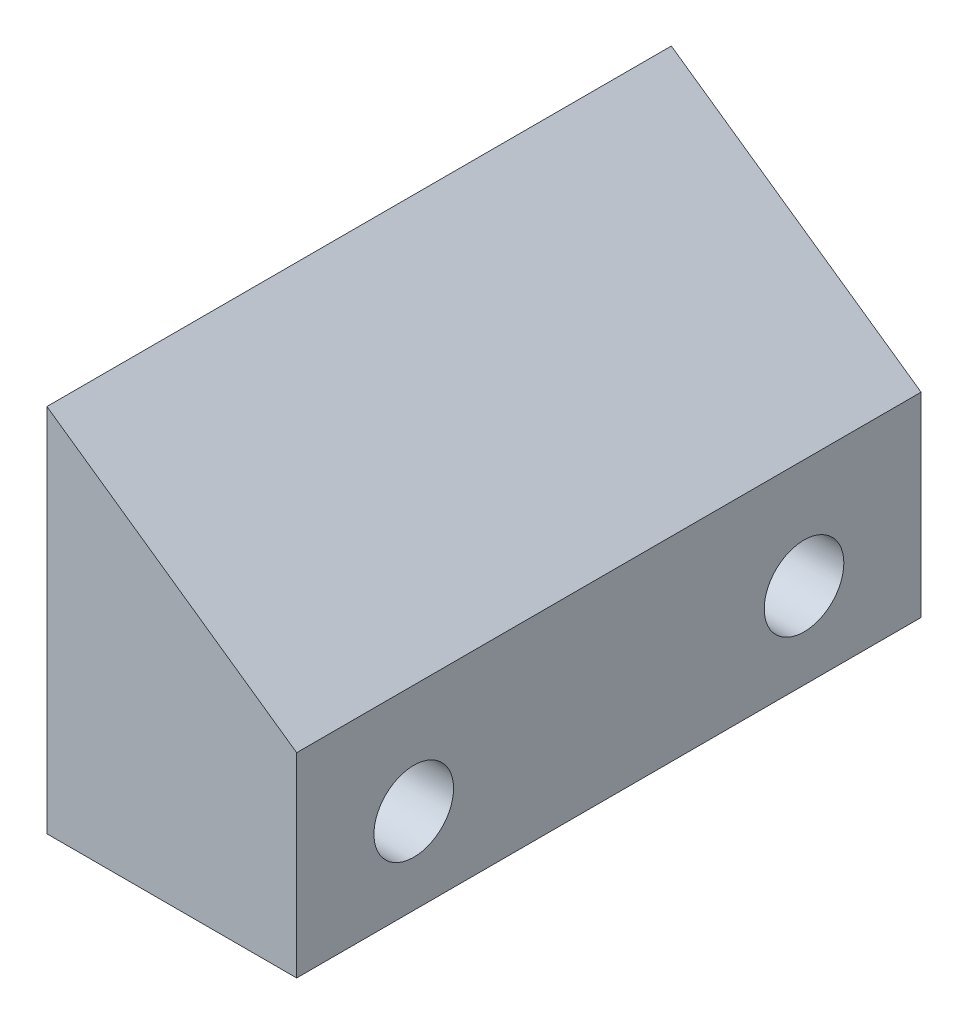
ISO-10303-21;
HEADER;
FILE_DESCRIPTION(('STEP AP214'),'2;1');
FILE_NAME('part.step','',(''),(''),'','','');
FILE_SCHEMA(('AUTOMOTIVE_DESIGN { 1 0 10303 214 1 1 1 1 }'));
ENDSEC;
DATA;
#1=APPLICATION_CONTEXT('core data for automotive mechanical design processes');
#2=APPLICATION_PROTOCOL_DEFINITION('international standard','automotive_design',2000,#1);
#3=PRODUCT_CONTEXT('',#1,'mechanical');
#4=PRODUCT('Part','Part','',(#3));
#5=PRODUCT_RELATED_PRODUCT_CATEGORY('part','',(#4));
#6=PRODUCT_DEFINITION_FORMATION('','',#4);
#7=PRODUCT_DEFINITION_CONTEXT('part definition',#1,'design');
#8=PRODUCT_DEFINITION('design','',#6,#7);
#9=PRODUCT_DEFINITION_SHAPE('','',#8);
#10=(LENGTH_UNIT() NAMED_UNIT(*) SI_UNIT(.MILLI.,.METRE.));
#11=(NAMED_UNIT(*) PLANE_ANGLE_UNIT() SI_UNIT($,.RADIAN.));
#12=(NAMED_UNIT(*) SI_UNIT($,.STERADIAN.) SOLID_ANGLE_UNIT());
#13=UNCERTAINTY_MEASURE_WITH_UNIT(LENGTH_MEASURE(1.E-05),#10,'distance_accuracy_value','');
#14=(GEOMETRIC_REPRESENTATION_CONTEXT(3) GLOBAL_UNCERTAINTY_ASSIGNED_CONTEXT((#13)) GLOBAL_UNIT_ASSIGNED_CONTEXT((#10,
#11,#12)) REPRESENTATION_CONTEXT('',''));
#15=CARTESIAN_POINT('',(0.,0.,0.));
#16=DIRECTION('',(0.,0.,1.));
#17=DIRECTION('',(1.,0.,0.));
#18=AXIS2_PLACEMENT_3D('',#15,#16,#17);
#19=CARTESIAN_POINT('',(32.,25.,40.));
#20=DIRECTION('',(-1.,0.,0.));
#21=DIRECTION('',(0.,0.,1.));
#22=AXIS2_PLACEMENT_3D('',#19,#20,#21);
#23=PLANE('',#22);
#24=DIRECTION('',(0.,1.,0.));
#25=VECTOR('',#24,1.);
#26=CARTESIAN_POINT('',(32.,25.,-40.));
#27=LINE('',#26,#25);
#28=CARTESIAN_POINT('',(32.,0.,-40.));
#29=VERTEX_POINT('',#28);
#30=CARTESIAN_POINT('',(32.,25.,-40.));
#31=VERTEX_POINT('',#30);
#32=EDGE_CURVE('E99',#29,#31,#27,.T.);
#33=ORIENTED_EDGE('',*,*,#32,.T.);
#34=DIRECTION('',(0.,0.,-1.));
#35=VECTOR('',#34,1.);
#36=CARTESIAN_POINT('',(32.,25.,40.));
#37=LINE('',#36,#35);
#38=CARTESIAN_POINT('',(32.,25.,40.));
#39=VERTEX_POINT('',#38);
#40=EDGE_CURVE('E52',#39,#31,#37,.T.);
#41=ORIENTED_EDGE('',*,*,#40,.F.);
#42=DIRECTION('',(0.,1.,0.));
#43=VECTOR('',#42,1.);
#44=CARTESIAN_POINT('',(32.,25.,40.));
#45=LINE('',#44,#43);
#46=CARTESIAN_POINT('',(32.,0.,40.));
#47=VERTEX_POINT('',#46);
#48=EDGE_CURVE('E90',#47,#39,#45,.T.);
#49=ORIENTED_EDGE('',*,*,#48,.F.);
#50=DIRECTION('',(0.,0.,-1.));
#51=VECTOR('',#50,1.);
#52=CARTESIAN_POINT('',(32.,0.,40.));
#53=LINE('',#52,#51);
#54=EDGE_CURVE('E11',#47,#29,#53,.T.);
#55=ORIENTED_EDGE('',*,*,#54,.T.);
#56=EDGE_LOOP('',(#33,#41,#49,#55));
#57=FACE_BOUND('',#56,.T.);
#58=CARTESIAN_POINT('',(32.,11.,-25.));
#59=DIRECTION('',(1.,0.,0.));
#60=DIRECTION('',(0.,0.,-1.));
#61=AXIS2_PLACEMENT_3D('',#58,#59,#60);
#62=CIRCLE('',#61,5.09999999999999);
#63=CARTESIAN_POINT('',(32.,11.,-30.1));
#64=VERTEX_POINT('',#63);
#65=EDGE_CURVE('E123',#64,#64,#62,.T.);
#66=ORIENTED_EDGE('',*,*,#65,.F.);
#67=EDGE_LOOP('',(#66));
#68=FACE_BOUND('',#67,.T.);
#69=CARTESIAN_POINT('',(32.,11.,25.));
#70=DIRECTION('',(1.,0.,0.));
#71=DIRECTION('',(0.,0.,-1.));
#72=AXIS2_PLACEMENT_3D('',#69,#70,#71);
#73=CIRCLE('',#72,5.09999999999999);
#74=CARTESIAN_POINT('',(32.,11.,19.9));
#75=VERTEX_POINT('',#74);
#76=EDGE_CURVE('E129',#75,#75,#73,.T.);
#77=ORIENTED_EDGE('',*,*,#76,.F.);
#78=EDGE_LOOP('',(#77));
#79=FACE_BOUND('',#78,.T.);
#80=ADVANCED_FACE('F43',(#57,#68,#79),#23,.F.);
#81=CARTESIAN_POINT('',(32.,0.,40.));
#82=DIRECTION('',(0.,1.,0.));
#83=DIRECTION('',(0.,0.,1.));
#84=AXIS2_PLACEMENT_3D('',#81,#82,#83);
#85=PLANE('',#84);
#86=DIRECTION('',(1.,0.,0.));
#87=VECTOR('',#86,1.);
#88=CARTESIAN_POINT('',(32.,0.,-40.));
#89=LINE('',#88,#87);
#90=CARTESIAN_POINT('',(0.,0.,-40.));
#91=VERTEX_POINT('',#90);
#92=EDGE_CURVE('E107',#91,#29,#89,.T.);
#93=ORIENTED_EDGE('',*,*,#92,.T.);
#94=ORIENTED_EDGE('',*,*,#54,.F.);
#95=DIRECTION('',(1.,0.,0.));
#96=VECTOR('',#95,1.);
#97=CARTESIAN_POINT('',(32.,0.,40.));
#98=LINE('',#97,#96);
#99=CARTESIAN_POINT('',(0.,0.,40.));
#100=VERTEX_POINT('',#99);
#101=EDGE_CURVE('E95',#100,#47,#98,.T.);
#102=ORIENTED_EDGE('',*,*,#101,.F.);
#103=DIRECTION('',(0.,0.,-1.));
#104=VECTOR('',#103,1.);
#105=CARTESIAN_POINT('',(0.,0.,40.));
#106=LINE('',#105,#104);
#107=EDGE_CURVE('E103',#100,#91,#106,.T.);
#108=ORIENTED_EDGE('',*,*,#107,.T.);
#109=EDGE_LOOP('',(#93,#94,#102,#108));
#110=FACE_BOUND('',#109,.T.);
#111=ADVANCED_FACE('F45',(#110),#85,.F.);
#112=CARTESIAN_POINT('',(0.,47.4066412227106,40.));
#113=DIRECTION('',(-0.573576436351044,-0.819152044288993,0.));
#114=DIRECTION('',(0.819152044288993,-0.573576436351044,0.));
#115=AXIS2_PLACEMENT_3D('',#112,#113,#114);
#116=PLANE('',#115);
#117=DIRECTION('',(-0.819152044288993,0.573576436351044,0.));
#118=VECTOR('',#117,1.);
#119=CARTESIAN_POINT('',(0.,47.4066412227106,-40.));
#120=LINE('',#119,#118);
#121=CARTESIAN_POINT('',(0.,47.4066412227106,-40.));
#122=VERTEX_POINT('',#121);
#123=EDGE_CURVE('E77',#31,#122,#120,.T.);
#124=ORIENTED_EDGE('',*,*,#123,.T.);
#125=DIRECTION('',(0.,0.,-1.));
#126=VECTOR('',#125,1.);
#127=CARTESIAN_POINT('',(0.,47.4066412227106,40.));
#128=LINE('',#127,#126);
#129=CARTESIAN_POINT('',(0.,47.4066412227106,40.));
#130=VERTEX_POINT('',#129);
#131=EDGE_CURVE('E100',#130,#122,#128,.T.);
#132=ORIENTED_EDGE('',*,*,#131,.F.);
#133=DIRECTION('',(-0.819152044288993,0.573576436351044,0.));
#134=VECTOR('',#133,1.);
#135=CARTESIAN_POINT('',(0.,47.4066412227106,40.));
#136=LINE('',#135,#134);
#137=EDGE_CURVE('E93',#39,#130,#136,.T.);
#138=ORIENTED_EDGE('',*,*,#137,.F.);
#139=ORIENTED_EDGE('',*,*,#40,.T.);
#140=EDGE_LOOP('',(#124,#132,#138,#139));
#141=FACE_BOUND('',#140,.T.);
#142=ADVANCED_FACE('F101',(#141),#116,.F.);
#143=CARTESIAN_POINT('',(0.,0.,40.));
#144=DIRECTION('',(1.,0.,0.));
#145=DIRECTION('',(0.,0.,-1.));
#146=AXIS2_PLACEMENT_3D('',#143,#144,#145);
#147=PLANE('',#146);
#148=CARTESIAN_POINT('',(0.,11.,25.));
#149=DIRECTION('',(1.,0.,0.));
#150=DIRECTION('',(0.,0.,-1.));
#151=AXIS2_PLACEMENT_3D('',#148,#149,#150);
#152=CIRCLE('',#151,5.09999999999999);
#153=CARTESIAN_POINT('',(0.,11.,19.9));
#154=VERTEX_POINT('',#153);
#155=EDGE_CURVE('E126',#154,#154,#152,.T.);
#156=ORIENTED_EDGE('',*,*,#155,.T.);
#157=EDGE_LOOP('',(#156));
#158=FACE_BOUND('',#157,.T.);
#159=CARTESIAN_POINT('',(0.,11.,-25.));
#160=DIRECTION('',(1.,0.,0.));
#161=DIRECTION('',(0.,0.,-1.));
#162=AXIS2_PLACEMENT_3D('',#159,#160,#161);
#163=CIRCLE('',#162,5.09999999999999);
#164=CARTESIAN_POINT('',(0.,11.,-30.1));
#165=VERTEX_POINT('',#164);
#166=EDGE_CURVE('E110',#165,#165,#163,.T.);
#167=ORIENTED_EDGE('',*,*,#166,.T.);
#168=EDGE_LOOP('',(#167));
#169=FACE_BOUND('',#168,.T.);
#170=DIRECTION('',(0.,-1.,0.));
#171=VECTOR('',#170,1.);
#172=CARTESIAN_POINT('',(0.,0.,-40.));
#173=LINE('',#172,#171);
#174=EDGE_CURVE('E83',#122,#91,#173,.T.);
#175=ORIENTED_EDGE('',*,*,#174,.T.);
#176=ORIENTED_EDGE('',*,*,#107,.F.);
#177=DIRECTION('',(0.,-1.,0.));
#178=VECTOR('',#177,1.);
#179=CARTESIAN_POINT('',(0.,0.,40.));
#180=LINE('',#179,#178);
#181=EDGE_CURVE('E60',#130,#100,#180,.T.);
#182=ORIENTED_EDGE('',*,*,#181,.F.);
#183=ORIENTED_EDGE('',*,*,#131,.T.);
#184=EDGE_LOOP('',(#175,#176,#182,#183));
#185=FACE_BOUND('',#184,.T.);
#186=ADVANCED_FACE('F115',(#158,#169,#185),#147,.F.);
#187=CARTESIAN_POINT('',(0.,0.,40.));
#188=DIRECTION('',(0.,0.,-1.));
#189=DIRECTION('',(-1.,0.,0.));
#190=AXIS2_PLACEMENT_3D('',#187,#188,#189);
#191=PLANE('',#190);
#192=ORIENTED_EDGE('',*,*,#101,.T.);
#193=ORIENTED_EDGE('',*,*,#48,.T.);
#194=ORIENTED_EDGE('',*,*,#137,.T.);
#195=ORIENTED_EDGE('',*,*,#181,.T.);
#196=EDGE_LOOP('',(#192,#193,#194,#195));
#197=FACE_BOUND('',#196,.T.);
#198=ADVANCED_FACE('F91',(#197),#191,.F.);
#199=CARTESIAN_POINT('',(0.,0.,-40.));
#200=DIRECTION('',(0.,0.,-1.));
#201=DIRECTION('',(-1.,0.,0.));
#202=AXIS2_PLACEMENT_3D('',#199,#200,#201);
#203=PLANE('',#202);
#204=ORIENTED_EDGE('',*,*,#92,.F.);
#205=ORIENTED_EDGE('',*,*,#174,.F.);
#206=ORIENTED_EDGE('',*,*,#123,.F.);
#207=ORIENTED_EDGE('',*,*,#32,.F.);
#208=EDGE_LOOP('',(#204,#205,#206,#207));
#209=FACE_BOUND('',#208,.T.);
#210=ADVANCED_FACE('F118',(#209),#203,.T.);
#211=CARTESIAN_POINT('',(32.,11.,-25.));
#212=DIRECTION('',(1.,0.,0.));
#213=DIRECTION('',(0.,0.,-1.));
#214=AXIS2_PLACEMENT_3D('',#211,#212,#213);
#215=CYLINDRICAL_SURFACE('',#214,5.09999999999999);
#216=ORIENTED_EDGE('',*,*,#166,.F.);
#217=EDGE_LOOP('',(#216));
#218=FACE_BOUND('',#217,.T.);
#219=ORIENTED_EDGE('',*,*,#65,.T.);
#220=EDGE_LOOP('',(#219));
#221=FACE_BOUND('',#220,.T.);
#222=ADVANCED_FACE('F148',(#218,#221),#215,.F.);
#223=CARTESIAN_POINT('',(32.,11.,25.));
#224=DIRECTION('',(1.,0.,0.));
#225=DIRECTION('',(0.,0.,-1.));
#226=AXIS2_PLACEMENT_3D('',#223,#224,#225);
#227=CYLINDRICAL_SURFACE('',#226,5.09999999999999);
#228=ORIENTED_EDGE('',*,*,#155,.F.);
#229=EDGE_LOOP('',(#228));
#230=FACE_BOUND('',#229,.T.);
#231=ORIENTED_EDGE('',*,*,#76,.T.);
#232=EDGE_LOOP('',(#231));
#233=FACE_BOUND('',#232,.T.);
#234=ADVANCED_FACE('F133',(#230,#233),#227,.F.);
#235=CLOSED_SHELL('',(#80,#111,#142,#186,#198,#210,#222,#234));
#236=MANIFOLD_SOLID_BREP('B2',#235);
#237=ADVANCED_BREP_SHAPE_REPRESENTATION('',(#18,#236),#14);
#238=SHAPE_DEFINITION_REPRESENTATION(#9,#237);
ENDSEC;
END-ISO-10303-21;
